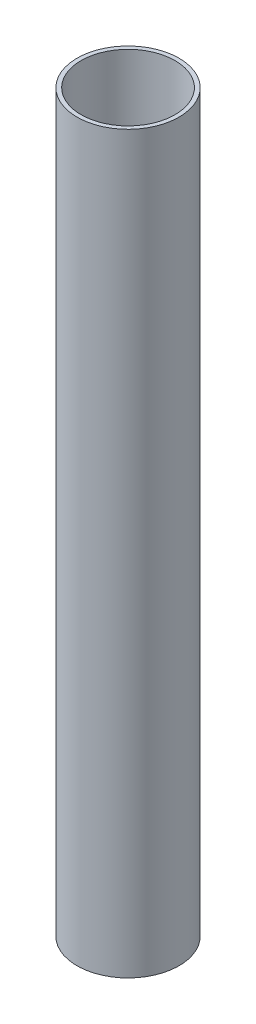
ISO-10303-21;
HEADER;
FILE_DESCRIPTION(('STEP AP214'),'2;1');
FILE_NAME('part.step','',(''),(''),'','','');
FILE_SCHEMA(('AUTOMOTIVE_DESIGN { 1 0 10303 214 1 1 1 1 }'));
ENDSEC;
DATA;
#1=APPLICATION_CONTEXT('core data for automotive mechanical design processes');
#2=APPLICATION_PROTOCOL_DEFINITION('international standard','automotive_design',2000,#1);
#3=PRODUCT_CONTEXT('',#1,'mechanical');
#4=PRODUCT('Part','Part','',(#3));
#5=PRODUCT_RELATED_PRODUCT_CATEGORY('part','',(#4));
#6=PRODUCT_DEFINITION_FORMATION('','',#4);
#7=PRODUCT_DEFINITION_CONTEXT('part definition',#1,'design');
#8=PRODUCT_DEFINITION('design','',#6,#7);
#9=PRODUCT_DEFINITION_SHAPE('','',#8);
#10=(LENGTH_UNIT() NAMED_UNIT(*) SI_UNIT(.MILLI.,.METRE.));
#11=(NAMED_UNIT(*) PLANE_ANGLE_UNIT() SI_UNIT($,.RADIAN.));
#12=(NAMED_UNIT(*) SI_UNIT($,.STERADIAN.) SOLID_ANGLE_UNIT());
#13=UNCERTAINTY_MEASURE_WITH_UNIT(LENGTH_MEASURE(1.E-05),#10,'distance_accuracy_value','');
#14=(GEOMETRIC_REPRESENTATION_CONTEXT(3) GLOBAL_UNCERTAINTY_ASSIGNED_CONTEXT((#13)) GLOBAL_UNIT_ASSIGNED_CONTEXT((#10,
#11,#12)) REPRESENTATION_CONTEXT('',''));
#15=CARTESIAN_POINT('',(0.,0.,0.));
#16=DIRECTION('',(0.,0.,1.));
#17=DIRECTION('',(1.,0.,0.));
#18=AXIS2_PLACEMENT_3D('',#15,#16,#17);
#19=CARTESIAN_POINT('',(0.,180.,0.));
#20=DIRECTION('',(0.,1.,0.));
#21=DIRECTION('',(0.,0.,1.));
#22=AXIS2_PLACEMENT_3D('',#19,#20,#21);
#23=PLANE('',#22);
#24=CARTESIAN_POINT('',(0.,180.,0.));
#25=DIRECTION('',(0.,1.,0.));
#26=DIRECTION('',(0.,0.,1.));
#27=AXIS2_PLACEMENT_3D('',#24,#25,#26);
#28=CIRCLE('',#27,12.5);
#29=CARTESIAN_POINT('',(0.,180.,-12.5));
#30=VERTEX_POINT('',#29);
#31=EDGE_CURVE('E10',#30,#30,#28,.T.);
#32=ORIENTED_EDGE('',*,*,#31,.T.);
#33=EDGE_LOOP('',(#32));
#34=FACE_BOUND('',#33,.T.);
#35=CARTESIAN_POINT('',(0.,180.,0.));
#36=DIRECTION('',(0.,1.,0.));
#37=DIRECTION('',(0.,0.,1.));
#38=AXIS2_PLACEMENT_3D('',#35,#36,#37);
#39=CIRCLE('',#38,11.5);
#40=CARTESIAN_POINT('',(0.,180.,-11.5));
#41=VERTEX_POINT('',#40);
#42=EDGE_CURVE('E44',#41,#41,#39,.T.);
#43=ORIENTED_EDGE('',*,*,#42,.F.);
#44=EDGE_LOOP('',(#43));
#45=FACE_BOUND('',#44,.T.);
#46=ADVANCED_FACE('F33',(#34,#45),#23,.T.);
#47=CARTESIAN_POINT('',(0.,0.,0.));
#48=DIRECTION('',(0.,1.,0.));
#49=DIRECTION('',(0.,0.,1.));
#50=AXIS2_PLACEMENT_3D('',#47,#48,#49);
#51=PLANE('',#50);
#52=CARTESIAN_POINT('',(0.,0.,0.));
#53=DIRECTION('',(0.,1.,0.));
#54=DIRECTION('',(0.,0.,1.));
#55=AXIS2_PLACEMENT_3D('',#52,#53,#54);
#56=CIRCLE('',#55,12.5);
#57=CARTESIAN_POINT('',(0.,0.,-12.5));
#58=VERTEX_POINT('',#57);
#59=EDGE_CURVE('E37',#58,#58,#56,.T.);
#60=ORIENTED_EDGE('',*,*,#59,.F.);
#61=EDGE_LOOP('',(#60));
#62=FACE_BOUND('',#61,.T.);
#63=CARTESIAN_POINT('',(0.,0.,0.));
#64=DIRECTION('',(0.,1.,0.));
#65=DIRECTION('',(0.,0.,1.));
#66=AXIS2_PLACEMENT_3D('',#63,#64,#65);
#67=CIRCLE('',#66,11.5);
#68=CARTESIAN_POINT('',(0.,0.,-11.5));
#69=VERTEX_POINT('',#68);
#70=EDGE_CURVE('E46',#69,#69,#67,.T.);
#71=ORIENTED_EDGE('',*,*,#70,.T.);
#72=EDGE_LOOP('',(#71));
#73=FACE_BOUND('',#72,.T.);
#74=ADVANCED_FACE('F56',(#62,#73),#51,.F.);
#75=CARTESIAN_POINT('',(0.,180.,0.));
#76=DIRECTION('',(0.,-1.,0.));
#77=DIRECTION('',(0.,0.,-1.));
#78=AXIS2_PLACEMENT_3D('',#75,#76,#77);
#79=CYLINDRICAL_SURFACE('',#78,12.5);
#80=CARTESIAN_POINT('',(0.,180.,-12.5));
#81=CARTESIAN_POINT('',(0.,178.125,-12.5));
#82=CARTESIAN_POINT('',(0.,176.25,-12.5));
#83=CARTESIAN_POINT('',(0.,172.5,-12.5));
#84=CARTESIAN_POINT('',(0.,170.625,-12.5));
#85=CARTESIAN_POINT('',(0.,166.875,-12.5));
#86=CARTESIAN_POINT('',(0.,165.,-12.5));
#87=CARTESIAN_POINT('',(0.,161.25,-12.5));
#88=CARTESIAN_POINT('',(0.,159.375,-12.5));
#89=CARTESIAN_POINT('',(0.,155.625,-12.5));
#90=CARTESIAN_POINT('',(0.,153.75,-12.5));
#91=CARTESIAN_POINT('',(0.,150.,-12.5));
#92=CARTESIAN_POINT('',(0.,148.125,-12.5));
#93=CARTESIAN_POINT('',(0.,144.375,-12.5));
#94=CARTESIAN_POINT('',(0.,142.5,-12.5));
#95=CARTESIAN_POINT('',(0.,138.75,-12.5));
#96=CARTESIAN_POINT('',(0.,136.875,-12.5));
#97=CARTESIAN_POINT('',(0.,133.125,-12.5));
#98=CARTESIAN_POINT('',(0.,131.25,-12.5));
#99=CARTESIAN_POINT('',(0.,127.5,-12.5));
#100=CARTESIAN_POINT('',(0.,125.625,-12.5));
#101=CARTESIAN_POINT('',(0.,121.875,-12.5));
#102=CARTESIAN_POINT('',(0.,120.,-12.5));
#103=CARTESIAN_POINT('',(0.,116.25,-12.5));
#104=CARTESIAN_POINT('',(0.,114.375,-12.5));
#105=CARTESIAN_POINT('',(0.,110.625,-12.5));
#106=CARTESIAN_POINT('',(0.,108.75,-12.5));
#107=CARTESIAN_POINT('',(0.,105.,-12.5));
#108=CARTESIAN_POINT('',(0.,103.125,-12.5));
#109=CARTESIAN_POINT('',(0.,99.375,-12.5));
#110=CARTESIAN_POINT('',(0.,97.5,-12.5));
#111=CARTESIAN_POINT('',(0.,93.75,-12.5));
#112=CARTESIAN_POINT('',(0.,91.875,-12.5));
#113=CARTESIAN_POINT('',(0.,88.125,-12.5));
#114=CARTESIAN_POINT('',(0.,86.25,-12.5));
#115=CARTESIAN_POINT('',(0.,82.5,-12.5));
#116=CARTESIAN_POINT('',(0.,80.625,-12.5));
#117=CARTESIAN_POINT('',(0.,76.875,-12.5));
#118=CARTESIAN_POINT('',(0.,75.,-12.5));
#119=CARTESIAN_POINT('',(0.,71.25,-12.5));
#120=CARTESIAN_POINT('',(0.,69.375,-12.5));
#121=CARTESIAN_POINT('',(0.,65.625,-12.5));
#122=CARTESIAN_POINT('',(0.,63.75,-12.5));
#123=CARTESIAN_POINT('',(0.,60.,-12.5));
#124=CARTESIAN_POINT('',(0.,58.125,-12.5));
#125=CARTESIAN_POINT('',(0.,54.375,-12.5));
#126=CARTESIAN_POINT('',(0.,52.5,-12.5));
#127=CARTESIAN_POINT('',(0.,48.75,-12.5));
#128=CARTESIAN_POINT('',(0.,46.875,-12.5));
#129=CARTESIAN_POINT('',(0.,43.125,-12.5));
#130=CARTESIAN_POINT('',(0.,41.25,-12.5));
#131=CARTESIAN_POINT('',(0.,37.5,-12.5));
#132=CARTESIAN_POINT('',(0.,35.625,-12.5));
#133=CARTESIAN_POINT('',(0.,31.875,-12.5));
#134=CARTESIAN_POINT('',(0.,30.,-12.5));
#135=CARTESIAN_POINT('',(0.,26.25,-12.5));
#136=CARTESIAN_POINT('',(0.,24.375,-12.5));
#137=CARTESIAN_POINT('',(0.,20.625,-12.5));
#138=CARTESIAN_POINT('',(0.,18.75,-12.5));
#139=CARTESIAN_POINT('',(0.,15.,-12.5));
#140=CARTESIAN_POINT('',(0.,13.125,-12.5));
#141=CARTESIAN_POINT('',(0.,9.37499999999998,-12.5));
#142=CARTESIAN_POINT('',(0.,7.49999999999997,-12.5));
#143=CARTESIAN_POINT('',(0.,3.74999999999997,-12.5));
#144=CARTESIAN_POINT('',(0.,1.87499999999997,-12.5));
#145=CARTESIAN_POINT('',(0.,0.,-12.5));
#146=B_SPLINE_CURVE_WITH_KNOTS('',3,(#80,#81,#82,#83,#84,#85,#86,#87,#88,#89,#90,#91,#92,#93,
#94,#95,#96,#97,#98,#99,#100,#101,#102,#103,#104,#105,#106,#107,#108,#109,#110,#111,#112,#113,
#114,#115,#116,#117,#118,#119,#120,#121,#122,#123,#124,#125,#126,#127,#128,#129,#130,#131,#132,
#133,#134,#135,#136,#137,#138,#139,#140,#141,#142,#143,#144,#145),.UNSPECIFIED.,.F.,.F.,(4,2,2,
2,2,2,2,2,2,2,2,2,2,2,2,2,2,2,2,2,2,2,2,2,2,2,2,2,2,2,2,2,4),(0.,5.62499999999999,11.25,16.875,
22.5,28.125,33.75,39.375,45.,50.625,56.25,61.875,67.5,73.125,78.75,84.375,90.,95.625,101.25,
106.875,112.5,118.125,123.75,129.375,135.,140.625,146.25,151.875,157.5,163.125,168.75,174.375,
180.),.UNSPECIFIED.);
#147=EDGE_CURVE('BSEAM35',#30,#58,#146,.T.);
#148=ORIENTED_EDGE('',*,*,#31,.F.);
#149=ORIENTED_EDGE('',*,*,#59,.T.);
#150=ORIENTED_EDGE('',*,*,#147,.T.);
#151=ORIENTED_EDGE('',*,*,#147,.F.);
#152=EDGE_LOOP('',(#148,#150,#149,#151));
#153=FACE_BOUND('',#152,.T.);
#154=ADVANCED_FACE('F35',(#153),#79,.T.);
#155=CARTESIAN_POINT('',(0.,180.,0.));
#156=DIRECTION('',(0.,-1.,0.));
#157=DIRECTION('',(0.,0.,-1.));
#158=AXIS2_PLACEMENT_3D('',#155,#156,#157);
#159=CYLINDRICAL_SURFACE('',#158,11.5);
#160=CARTESIAN_POINT('',(0.,180.,-11.5));
#161=CARTESIAN_POINT('',(0.,178.125,-11.5));
#162=CARTESIAN_POINT('',(0.,176.25,-11.5));
#163=CARTESIAN_POINT('',(0.,172.5,-11.5));
#164=CARTESIAN_POINT('',(0.,170.625,-11.5));
#165=CARTESIAN_POINT('',(0.,166.875,-11.5));
#166=CARTESIAN_POINT('',(0.,165.,-11.5));
#167=CARTESIAN_POINT('',(0.,161.25,-11.5));
#168=CARTESIAN_POINT('',(0.,159.375,-11.5));
#169=CARTESIAN_POINT('',(0.,155.625,-11.5));
#170=CARTESIAN_POINT('',(0.,153.75,-11.5));
#171=CARTESIAN_POINT('',(0.,150.,-11.5));
#172=CARTESIAN_POINT('',(0.,148.125,-11.5));
#173=CARTESIAN_POINT('',(0.,144.375,-11.5));
#174=CARTESIAN_POINT('',(0.,142.5,-11.5));
#175=CARTESIAN_POINT('',(0.,138.75,-11.5));
#176=CARTESIAN_POINT('',(0.,136.875,-11.5));
#177=CARTESIAN_POINT('',(0.,133.125,-11.5));
#178=CARTESIAN_POINT('',(0.,131.25,-11.5));
#179=CARTESIAN_POINT('',(0.,127.5,-11.5));
#180=CARTESIAN_POINT('',(0.,125.625,-11.5));
#181=CARTESIAN_POINT('',(0.,121.875,-11.5));
#182=CARTESIAN_POINT('',(0.,120.,-11.5));
#183=CARTESIAN_POINT('',(0.,116.25,-11.5));
#184=CARTESIAN_POINT('',(0.,114.375,-11.5));
#185=CARTESIAN_POINT('',(0.,110.625,-11.5));
#186=CARTESIAN_POINT('',(0.,108.75,-11.5));
#187=CARTESIAN_POINT('',(0.,105.,-11.5));
#188=CARTESIAN_POINT('',(0.,103.125,-11.5));
#189=CARTESIAN_POINT('',(0.,99.375,-11.5));
#190=CARTESIAN_POINT('',(0.,97.5,-11.5));
#191=CARTESIAN_POINT('',(0.,93.75,-11.5));
#192=CARTESIAN_POINT('',(0.,91.875,-11.5));
#193=CARTESIAN_POINT('',(0.,88.125,-11.5));
#194=CARTESIAN_POINT('',(0.,86.25,-11.5));
#195=CARTESIAN_POINT('',(0.,82.5,-11.5));
#196=CARTESIAN_POINT('',(0.,80.625,-11.5));
#197=CARTESIAN_POINT('',(0.,76.875,-11.5));
#198=CARTESIAN_POINT('',(0.,75.,-11.5));
#199=CARTESIAN_POINT('',(0.,71.25,-11.5));
#200=CARTESIAN_POINT('',(0.,69.375,-11.5));
#201=CARTESIAN_POINT('',(0.,65.625,-11.5));
#202=CARTESIAN_POINT('',(0.,63.75,-11.5));
#203=CARTESIAN_POINT('',(0.,60.,-11.5));
#204=CARTESIAN_POINT('',(0.,58.125,-11.5));
#205=CARTESIAN_POINT('',(0.,54.375,-11.5));
#206=CARTESIAN_POINT('',(0.,52.5,-11.5));
#207=CARTESIAN_POINT('',(0.,48.75,-11.5));
#208=CARTESIAN_POINT('',(0.,46.875,-11.5));
#209=CARTESIAN_POINT('',(0.,43.125,-11.5));
#210=CARTESIAN_POINT('',(0.,41.25,-11.5));
#211=CARTESIAN_POINT('',(0.,37.5,-11.5));
#212=CARTESIAN_POINT('',(0.,35.625,-11.5));
#213=CARTESIAN_POINT('',(0.,31.875,-11.5));
#214=CARTESIAN_POINT('',(0.,30.,-11.5));
#215=CARTESIAN_POINT('',(0.,26.25,-11.5));
#216=CARTESIAN_POINT('',(0.,24.375,-11.5));
#217=CARTESIAN_POINT('',(0.,20.625,-11.5));
#218=CARTESIAN_POINT('',(0.,18.75,-11.5));
#219=CARTESIAN_POINT('',(0.,15.,-11.5));
#220=CARTESIAN_POINT('',(0.,13.125,-11.5));
#221=CARTESIAN_POINT('',(0.,9.37499999999998,-11.5));
#222=CARTESIAN_POINT('',(0.,7.49999999999997,-11.5));
#223=CARTESIAN_POINT('',(0.,3.74999999999997,-11.5));
#224=CARTESIAN_POINT('',(0.,1.87499999999997,-11.5));
#225=CARTESIAN_POINT('',(0.,0.,-11.5));
#226=B_SPLINE_CURVE_WITH_KNOTS('',3,(#160,#161,#162,#163,#164,#165,#166,#167,#168,#169,#170,
#171,#172,#173,#174,#175,#176,#177,#178,#179,#180,#181,#182,#183,#184,#185,#186,#187,#188,#189,
#190,#191,#192,#193,#194,#195,#196,#197,#198,#199,#200,#201,#202,#203,#204,#205,#206,#207,#208,
#209,#210,#211,#212,#213,#214,#215,#216,#217,#218,#219,#220,#221,#222,#223,#224,#225),
.UNSPECIFIED.,.F.,.F.,(4,2,2,2,2,2,2,2,2,2,2,2,2,2,2,2,2,2,2,2,2,2,2,2,2,2,2,2,2,2,2,2,4),(0.,
5.62500000000002,11.25,16.875,22.5,28.125,33.75,39.375,45.,50.625,56.25,61.875,67.5,73.125,
78.75,84.375,90.,95.625,101.25,106.875,112.5,118.125,123.75,129.375,135.,140.625,146.25,151.875,
157.5,163.125,168.75,174.375,180.),.UNSPECIFIED.);
#227=EDGE_CURVE('BSEAM52',#41,#69,#226,.T.);
#228=ORIENTED_EDGE('',*,*,#42,.T.);
#229=ORIENTED_EDGE('',*,*,#70,.F.);
#230=ORIENTED_EDGE('',*,*,#227,.T.);
#231=ORIENTED_EDGE('',*,*,#227,.F.);
#232=EDGE_LOOP('',(#228,#230,#229,#231));
#233=FACE_BOUND('',#232,.T.);
#234=ADVANCED_FACE('F52',(#233),#159,.F.);
#235=CLOSED_SHELL('',(#46,#74,#154,#234));
#236=MANIFOLD_SOLID_BREP('B2',#235);
#237=ADVANCED_BREP_SHAPE_REPRESENTATION('',(#18,#236),#14);
#238=SHAPE_DEFINITION_REPRESENTATION(#9,#237);
ENDSEC;
END-ISO-10303-21;
